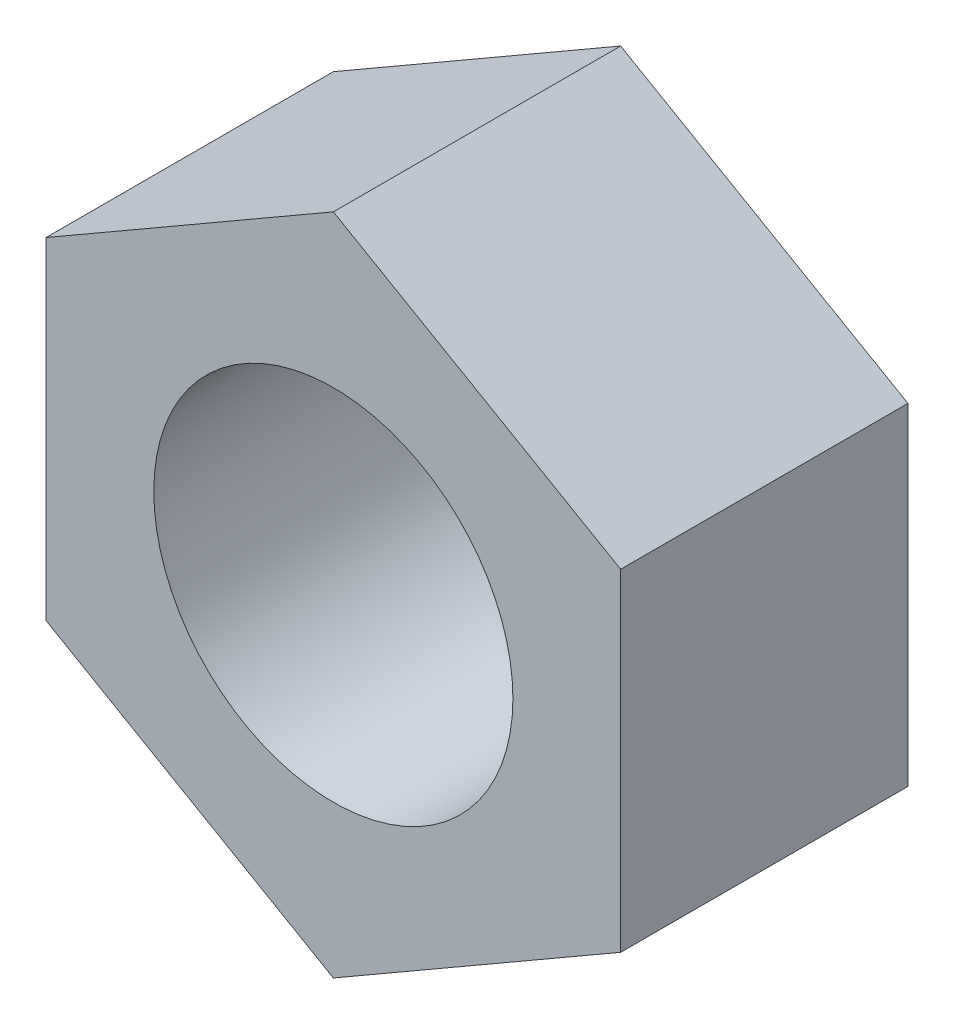
ISO-10303-21;
HEADER;
FILE_DESCRIPTION(('STEP AP214'),'2;1');
FILE_NAME('part.step','',(''),(''),'','','');
FILE_SCHEMA(('AUTOMOTIVE_DESIGN { 1 0 10303 214 1 1 1 1 }'));
ENDSEC;
DATA;
#1=APPLICATION_CONTEXT('core data for automotive mechanical design processes');
#2=APPLICATION_PROTOCOL_DEFINITION('international standard','automotive_design',2000,#1);
#3=PRODUCT_CONTEXT('',#1,'mechanical');
#4=PRODUCT('Part','Part','',(#3));
#5=PRODUCT_RELATED_PRODUCT_CATEGORY('part','',(#4));
#6=PRODUCT_DEFINITION_FORMATION('','',#4);
#7=PRODUCT_DEFINITION_CONTEXT('part definition',#1,'design');
#8=PRODUCT_DEFINITION('design','',#6,#7);
#9=PRODUCT_DEFINITION_SHAPE('','',#8);
#10=(LENGTH_UNIT() NAMED_UNIT(*) SI_UNIT(.MILLI.,.METRE.));
#11=(NAMED_UNIT(*) PLANE_ANGLE_UNIT() SI_UNIT($,.RADIAN.));
#12=(NAMED_UNIT(*) SI_UNIT($,.STERADIAN.) SOLID_ANGLE_UNIT());
#13=UNCERTAINTY_MEASURE_WITH_UNIT(LENGTH_MEASURE(1.E-05),#10,'distance_accuracy_value','');
#14=(GEOMETRIC_REPRESENTATION_CONTEXT(3) GLOBAL_UNCERTAINTY_ASSIGNED_CONTEXT((#13)) GLOBAL_UNIT_ASSIGNED_CONTEXT((#10,
#11,#12)) REPRESENTATION_CONTEXT('',''));
#15=CARTESIAN_POINT('',(0.,0.,0.));
#16=DIRECTION('',(0.,0.,1.));
#17=DIRECTION('',(1.,0.,0.));
#18=AXIS2_PLACEMENT_3D('',#15,#16,#17);
#19=CARTESIAN_POINT('',(0.,0.,2.4));
#20=DIRECTION('',(0.,0.,1.));
#21=DIRECTION('',(1.,0.,0.));
#22=AXIS2_PLACEMENT_3D('',#19,#20,#21);
#23=PLANE('',#22);
#24=DIRECTION('',(0.866025403784439,-0.5,0.));
#25=VECTOR('',#24,1.);
#26=CARTESIAN_POINT('',(-2.4,-1.3856406460551,2.4));
#27=LINE('',#26,#25);
#28=CARTESIAN_POINT('',(-2.4,-1.3856406460551,2.4));
#29=VERTEX_POINT('',#28);
#30=CARTESIAN_POINT('',(0.,-2.7712812921102,2.4));
#31=VERTEX_POINT('',#30);
#32=EDGE_CURVE('E129',#29,#31,#27,.T.);
#33=ORIENTED_EDGE('',*,*,#32,.T.);
#34=DIRECTION('',(0.866025403784439,0.5,0.));
#35=VECTOR('',#34,1.);
#36=CARTESIAN_POINT('',(0.,-2.7712812921102,2.4));
#37=LINE('',#36,#35);
#38=CARTESIAN_POINT('',(2.4,-1.3856406460551,2.4));
#39=VERTEX_POINT('',#38);
#40=EDGE_CURVE('E87',#31,#39,#37,.T.);
#41=ORIENTED_EDGE('',*,*,#40,.T.);
#42=DIRECTION('',(0.,1.,0.));
#43=VECTOR('',#42,1.);
#44=CARTESIAN_POINT('',(2.4,-1.3856406460551,2.4));
#45=LINE('',#44,#43);
#46=CARTESIAN_POINT('',(2.4,1.3856406460551,2.4));
#47=VERTEX_POINT('',#46);
#48=EDGE_CURVE('E100',#39,#47,#45,.T.);
#49=ORIENTED_EDGE('',*,*,#48,.T.);
#50=DIRECTION('',(-0.866025403784439,0.5,0.));
#51=VECTOR('',#50,1.);
#52=CARTESIAN_POINT('',(2.4,1.3856406460551,2.4));
#53=LINE('',#52,#51);
#54=CARTESIAN_POINT('',(0.,2.7712812921102,2.4));
#55=VERTEX_POINT('',#54);
#56=EDGE_CURVE('E94',#47,#55,#53,.T.);
#57=ORIENTED_EDGE('',*,*,#56,.T.);
#58=DIRECTION('',(-0.866025403784439,-0.5,0.));
#59=VECTOR('',#58,1.);
#60=CARTESIAN_POINT('',(0.,2.7712812921102,2.4));
#61=LINE('',#60,#59);
#62=CARTESIAN_POINT('',(-2.4,1.3856406460551,2.4));
#63=VERTEX_POINT('',#62);
#64=EDGE_CURVE('E98',#55,#63,#61,.T.);
#65=ORIENTED_EDGE('',*,*,#64,.T.);
#66=DIRECTION('',(0.,-1.,0.));
#67=VECTOR('',#66,1.);
#68=CARTESIAN_POINT('',(-2.4,1.3856406460551,2.4));
#69=LINE('',#68,#67);
#70=EDGE_CURVE('E50',#63,#29,#69,.T.);
#71=ORIENTED_EDGE('',*,*,#70,.T.);
#72=EDGE_LOOP('',(#33,#41,#49,#57,#65,#71));
#73=FACE_BOUND('',#72,.T.);
#74=CARTESIAN_POINT('',(0.,0.,2.4));
#75=DIRECTION('',(0.,0.,1.));
#76=DIRECTION('',(1.,0.,0.));
#77=AXIS2_PLACEMENT_3D('',#74,#75,#76);
#78=CIRCLE('',#77,1.5);
#79=CARTESIAN_POINT('',(1.5,0.,2.4));
#80=VERTEX_POINT('',#79);
#81=EDGE_CURVE('E122',#80,#80,#78,.T.);
#82=ORIENTED_EDGE('',*,*,#81,.F.);
#83=EDGE_LOOP('',(#82));
#84=FACE_BOUND('',#83,.T.);
#85=ADVANCED_FACE('F33',(#73,#84),#23,.T.);
#86=CARTESIAN_POINT('',(0.,0.,0.));
#87=DIRECTION('',(0.,0.,1.));
#88=DIRECTION('',(1.,0.,0.));
#89=AXIS2_PLACEMENT_3D('',#86,#87,#88);
#90=PLANE('',#89);
#91=DIRECTION('',(0.866025403784439,-0.5,0.));
#92=VECTOR('',#91,1.);
#93=CARTESIAN_POINT('',(-2.4,-1.3856406460551,0.));
#94=LINE('',#93,#92);
#95=CARTESIAN_POINT('',(-2.4,-1.3856406460551,0.));
#96=VERTEX_POINT('',#95);
#97=CARTESIAN_POINT('',(0.,-2.7712812921102,0.));
#98=VERTEX_POINT('',#97);
#99=EDGE_CURVE('E118',#96,#98,#94,.T.);
#100=ORIENTED_EDGE('',*,*,#99,.F.);
#101=DIRECTION('',(0.,-1.,0.));
#102=VECTOR('',#101,1.);
#103=CARTESIAN_POINT('',(-2.4,1.3856406460551,0.));
#104=LINE('',#103,#102);
#105=CARTESIAN_POINT('',(-2.4,1.3856406460551,0.));
#106=VERTEX_POINT('',#105);
#107=EDGE_CURVE('E79',#106,#96,#104,.T.);
#108=ORIENTED_EDGE('',*,*,#107,.F.);
#109=DIRECTION('',(-0.866025403784439,-0.5,0.));
#110=VECTOR('',#109,1.);
#111=CARTESIAN_POINT('',(0.,2.7712812921102,0.));
#112=LINE('',#111,#110);
#113=CARTESIAN_POINT('',(0.,2.7712812921102,0.));
#114=VERTEX_POINT('',#113);
#115=EDGE_CURVE('E73',#114,#106,#112,.T.);
#116=ORIENTED_EDGE('',*,*,#115,.F.);
#117=DIRECTION('',(-0.866025403784439,0.5,0.));
#118=VECTOR('',#117,1.);
#119=CARTESIAN_POINT('',(2.4,1.3856406460551,0.));
#120=LINE('',#119,#118);
#121=CARTESIAN_POINT('',(2.4,1.3856406460551,0.));
#122=VERTEX_POINT('',#121);
#123=EDGE_CURVE('E108',#122,#114,#120,.T.);
#124=ORIENTED_EDGE('',*,*,#123,.F.);
#125=DIRECTION('',(0.,1.,0.));
#126=VECTOR('',#125,1.);
#127=CARTESIAN_POINT('',(2.4,-1.3856406460551,0.));
#128=LINE('',#127,#126);
#129=CARTESIAN_POINT('',(2.4,-1.3856406460551,0.));
#130=VERTEX_POINT('',#129);
#131=EDGE_CURVE('E124',#130,#122,#128,.T.);
#132=ORIENTED_EDGE('',*,*,#131,.F.);
#133=DIRECTION('',(0.866025403784439,0.5,0.));
#134=VECTOR('',#133,1.);
#135=CARTESIAN_POINT('',(0.,-2.7712812921102,0.));
#136=LINE('',#135,#134);
#137=EDGE_CURVE('E121',#98,#130,#136,.T.);
#138=ORIENTED_EDGE('',*,*,#137,.F.);
#139=EDGE_LOOP('',(#100,#108,#116,#124,#132,#138));
#140=FACE_BOUND('',#139,.T.);
#141=CARTESIAN_POINT('',(0.,0.,0.));
#142=DIRECTION('',(0.,0.,1.));
#143=DIRECTION('',(1.,0.,0.));
#144=AXIS2_PLACEMENT_3D('',#141,#142,#143);
#145=CIRCLE('',#144,1.5);
#146=CARTESIAN_POINT('',(1.5,0.,0.));
#147=VERTEX_POINT('',#146);
#148=EDGE_CURVE('E222',#147,#147,#145,.T.);
#149=ORIENTED_EDGE('',*,*,#148,.T.);
#150=EDGE_LOOP('',(#149));
#151=FACE_BOUND('',#150,.T.);
#152=ADVANCED_FACE('F138',(#140,#151),#90,.F.);
#153=CARTESIAN_POINT('',(-2.4,-1.3856406460551,2.4));
#154=DIRECTION('',(0.5,0.866025403784439,0.));
#155=DIRECTION('',(-0.866025403784439,0.5,0.));
#156=AXIS2_PLACEMENT_3D('',#153,#154,#155);
#157=PLANE('',#156);
#158=ORIENTED_EDGE('',*,*,#99,.T.);
#159=DIRECTION('',(0.,0.,-1.));
#160=VECTOR('',#159,1.);
#161=CARTESIAN_POINT('',(0.,-2.7712812921102,2.4));
#162=LINE('',#161,#160);
#163=EDGE_CURVE('E11',#31,#98,#162,.T.);
#164=ORIENTED_EDGE('',*,*,#163,.F.);
#165=ORIENTED_EDGE('',*,*,#32,.F.);
#166=DIRECTION('',(0.,0.,-1.));
#167=VECTOR('',#166,1.);
#168=CARTESIAN_POINT('',(-2.4,-1.3856406460551,2.4));
#169=LINE('',#168,#167);
#170=EDGE_CURVE('E114',#29,#96,#169,.T.);
#171=ORIENTED_EDGE('',*,*,#170,.T.);
#172=EDGE_LOOP('',(#158,#164,#165,#171));
#173=FACE_BOUND('',#172,.T.);
#174=ADVANCED_FACE('F35',(#173),#157,.F.);
#175=CARTESIAN_POINT('',(0.,-2.7712812921102,2.4));
#176=DIRECTION('',(-0.5,0.866025403784439,0.));
#177=DIRECTION('',(-0.866025403784439,-0.5,0.));
#178=AXIS2_PLACEMENT_3D('',#175,#176,#177);
#179=PLANE('',#178);
#180=ORIENTED_EDGE('',*,*,#137,.T.);
#181=DIRECTION('',(0.,0.,-1.));
#182=VECTOR('',#181,1.);
#183=CARTESIAN_POINT('',(2.4,-1.3856406460551,2.4));
#184=LINE('',#183,#182);
#185=EDGE_CURVE('E42',#39,#130,#184,.T.);
#186=ORIENTED_EDGE('',*,*,#185,.F.);
#187=ORIENTED_EDGE('',*,*,#40,.F.);
#188=ORIENTED_EDGE('',*,*,#163,.T.);
#189=EDGE_LOOP('',(#180,#186,#187,#188));
#190=FACE_BOUND('',#189,.T.);
#191=ADVANCED_FACE('F163',(#190),#179,.F.);
#192=CARTESIAN_POINT('',(2.4,-1.3856406460551,2.4));
#193=DIRECTION('',(-1.,0.,0.));
#194=DIRECTION('',(0.,-1.,0.));
#195=AXIS2_PLACEMENT_3D('',#192,#193,#194);
#196=PLANE('',#195);
#197=ORIENTED_EDGE('',*,*,#131,.T.);
#198=DIRECTION('',(0.,0.,-1.));
#199=VECTOR('',#198,1.);
#200=CARTESIAN_POINT('',(2.4,1.3856406460551,2.4));
#201=LINE('',#200,#199);
#202=EDGE_CURVE('E109',#47,#122,#201,.T.);
#203=ORIENTED_EDGE('',*,*,#202,.F.);
#204=ORIENTED_EDGE('',*,*,#48,.F.);
#205=ORIENTED_EDGE('',*,*,#185,.T.);
#206=EDGE_LOOP('',(#197,#203,#204,#205));
#207=FACE_BOUND('',#206,.T.);
#208=ADVANCED_FACE('F135',(#207),#196,.F.);
#209=CARTESIAN_POINT('',(2.4,1.3856406460551,2.4));
#210=DIRECTION('',(-0.5,-0.866025403784439,0.));
#211=DIRECTION('',(0.866025403784439,-0.5,0.));
#212=AXIS2_PLACEMENT_3D('',#209,#210,#211);
#213=PLANE('',#212);
#214=ORIENTED_EDGE('',*,*,#123,.T.);
#215=DIRECTION('',(0.,0.,-1.));
#216=VECTOR('',#215,1.);
#217=CARTESIAN_POINT('',(0.,2.7712812921102,2.4));
#218=LINE('',#217,#216);
#219=EDGE_CURVE('E105',#55,#114,#218,.T.);
#220=ORIENTED_EDGE('',*,*,#219,.F.);
#221=ORIENTED_EDGE('',*,*,#56,.F.);
#222=ORIENTED_EDGE('',*,*,#202,.T.);
#223=EDGE_LOOP('',(#214,#220,#221,#222));
#224=FACE_BOUND('',#223,.T.);
#225=ADVANCED_FACE('F106',(#224),#213,.F.);
#226=CARTESIAN_POINT('',(0.,2.7712812921102,2.4));
#227=DIRECTION('',(0.5,-0.866025403784439,0.));
#228=DIRECTION('',(0.866025403784439,0.5,0.));
#229=AXIS2_PLACEMENT_3D('',#226,#227,#228);
#230=PLANE('',#229);
#231=ORIENTED_EDGE('',*,*,#115,.T.);
#232=DIRECTION('',(0.,0.,-1.));
#233=VECTOR('',#232,1.);
#234=CARTESIAN_POINT('',(-2.4,1.3856406460551,2.4));
#235=LINE('',#234,#233);
#236=EDGE_CURVE('E110',#63,#106,#235,.T.);
#237=ORIENTED_EDGE('',*,*,#236,.F.);
#238=ORIENTED_EDGE('',*,*,#64,.F.);
#239=ORIENTED_EDGE('',*,*,#219,.T.);
#240=EDGE_LOOP('',(#231,#237,#238,#239));
#241=FACE_BOUND('',#240,.T.);
#242=ADVANCED_FACE('F112',(#241),#230,.F.);
#243=CARTESIAN_POINT('',(-2.4,1.3856406460551,2.4));
#244=DIRECTION('',(1.,0.,0.));
#245=DIRECTION('',(0.,0.,-1.));
#246=AXIS2_PLACEMENT_3D('',#243,#244,#245);
#247=PLANE('',#246);
#248=ORIENTED_EDGE('',*,*,#107,.T.);
#249=ORIENTED_EDGE('',*,*,#170,.F.);
#250=ORIENTED_EDGE('',*,*,#70,.F.);
#251=ORIENTED_EDGE('',*,*,#236,.T.);
#252=EDGE_LOOP('',(#248,#249,#250,#251));
#253=FACE_BOUND('',#252,.T.);
#254=ADVANCED_FACE('F143',(#253),#247,.F.);
#255=CARTESIAN_POINT('',(0.,0.,2.4));
#256=DIRECTION('',(0.,0.,-1.));
#257=DIRECTION('',(-1.,0.,0.));
#258=AXIS2_PLACEMENT_3D('',#255,#256,#257);
#259=CYLINDRICAL_SURFACE('',#258,1.5);
#260=ORIENTED_EDGE('',*,*,#81,.T.);
#261=EDGE_LOOP('',(#260));
#262=FACE_BOUND('',#261,.T.);
#263=ORIENTED_EDGE('',*,*,#148,.F.);
#264=EDGE_LOOP('',(#263));
#265=FACE_BOUND('',#264,.T.);
#266=ADVANCED_FACE('F145',(#262,#265),#259,.F.);
#267=CLOSED_SHELL('',(#85,#152,#174,#191,#208,#225,#242,#254,#266));
#268=MANIFOLD_SOLID_BREP('B2',#267);
#269=ADVANCED_BREP_SHAPE_REPRESENTATION('',(#18,#268),#14);
#270=SHAPE_DEFINITION_REPRESENTATION(#9,#269);
ENDSEC;
END-ISO-10303-21;
